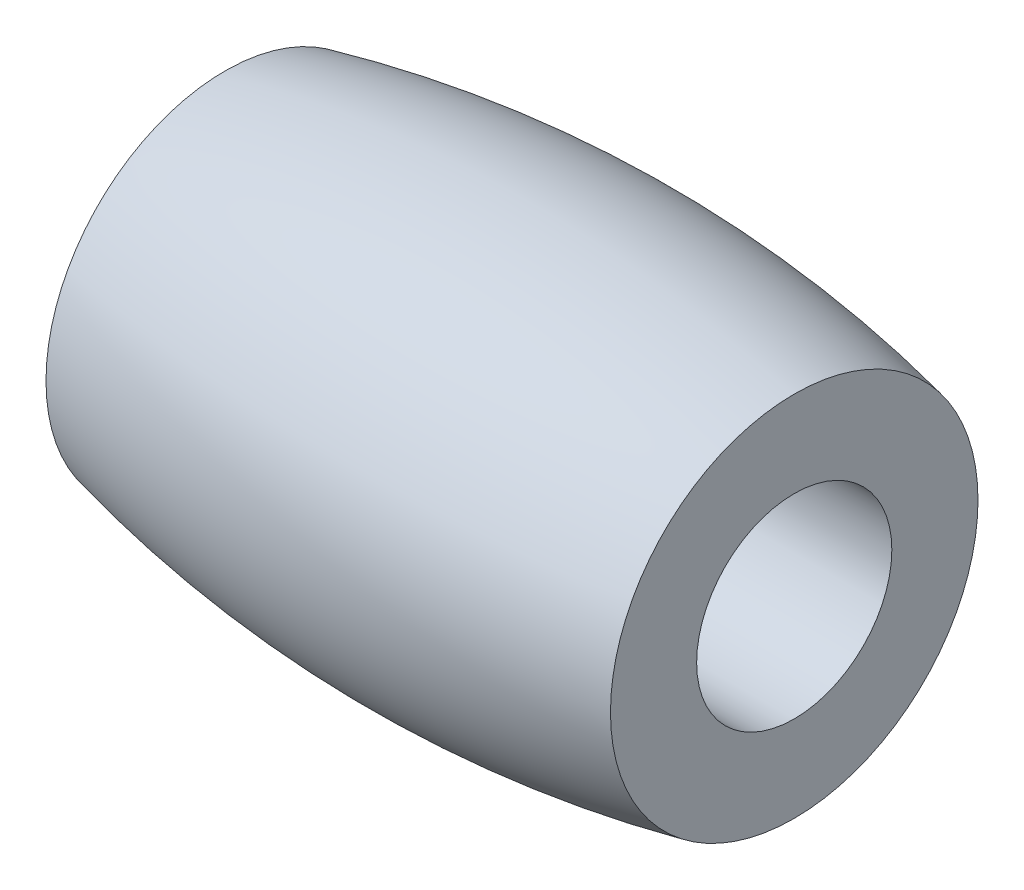
ISO-10303-21;
HEADER;
FILE_DESCRIPTION(('STEP AP214'),'2;1');
FILE_NAME('part.step','',(''),(''),'','','');
FILE_SCHEMA(('AUTOMOTIVE_DESIGN { 1 0 10303 214 1 1 1 1 }'));
ENDSEC;
DATA;
#1=APPLICATION_CONTEXT('core data for automotive mechanical design processes');
#2=APPLICATION_PROTOCOL_DEFINITION('international standard','automotive_design',2000,#1);
#3=PRODUCT_CONTEXT('',#1,'mechanical');
#4=PRODUCT('Part','Part','',(#3));
#5=PRODUCT_RELATED_PRODUCT_CATEGORY('part','',(#4));
#6=PRODUCT_DEFINITION_FORMATION('','',#4);
#7=PRODUCT_DEFINITION_CONTEXT('part definition',#1,'design');
#8=PRODUCT_DEFINITION('design','',#6,#7);
#9=PRODUCT_DEFINITION_SHAPE('','',#8);
#10=(LENGTH_UNIT() NAMED_UNIT(*) SI_UNIT(.MILLI.,.METRE.));
#11=(NAMED_UNIT(*) PLANE_ANGLE_UNIT() SI_UNIT($,.RADIAN.));
#12=(NAMED_UNIT(*) SI_UNIT($,.STERADIAN.) SOLID_ANGLE_UNIT());
#13=UNCERTAINTY_MEASURE_WITH_UNIT(LENGTH_MEASURE(1.E-05),#10,'distance_accuracy_value','');
#14=(GEOMETRIC_REPRESENTATION_CONTEXT(3) GLOBAL_UNCERTAINTY_ASSIGNED_CONTEXT((#13)) GLOBAL_UNIT_ASSIGNED_CONTEXT((#10,
#11,#12)) REPRESENTATION_CONTEXT('',''));
#15=CARTESIAN_POINT('',(0.,0.,0.));
#16=DIRECTION('',(0.,0.,1.));
#17=DIRECTION('',(1.,0.,0.));
#18=AXIS2_PLACEMENT_3D('',#15,#16,#17);
#19=CARTESIAN_POINT('',(-13.2061594202898,0.,0.));
#20=DIRECTION('',(1.,0.,0.));
#21=DIRECTION('',(0.,0.,-1.));
#22=AXIS2_PLACEMENT_3D('',#19,#20,#21);
#23=PLANE('',#22);
#24=CARTESIAN_POINT('',(-13.2061594202898,-3.81,0.));
#25=DIRECTION('',(-1.,0.,0.));
#26=DIRECTION('',(0.,0.,1.));
#27=AXIS2_PLACEMENT_3D('',#24,#25,#26);
#28=CIRCLE('',#27,3.81);
#29=CARTESIAN_POINT('',(-13.2061594202898,-3.81,3.81));
#30=VERTEX_POINT('',#29);
#31=EDGE_CURVE('E54',#30,#30,#28,.T.);
#32=ORIENTED_EDGE('',*,*,#31,.F.);
#33=EDGE_LOOP('',(#32));
#34=FACE_BOUND('',#33,.T.);
#35=CARTESIAN_POINT('',(-13.2061594202898,-3.81,0.));
#36=DIRECTION('',(-1.,0.,0.));
#37=DIRECTION('',(0.,0.,1.));
#38=AXIS2_PLACEMENT_3D('',#35,#36,#37);
#39=CIRCLE('',#38,6.985);
#40=CARTESIAN_POINT('',(-13.2061594202898,-3.81,6.985));
#41=VERTEX_POINT('',#40);
#42=EDGE_CURVE('E10',#41,#41,#39,.T.);
#43=ORIENTED_EDGE('',*,*,#42,.T.);
#44=EDGE_LOOP('',(#43));
#45=FACE_BOUND('',#44,.T.);
#46=ADVANCED_FACE('F37',(#34,#45),#23,.F.);
#47=CARTESIAN_POINT('',(-1.67259138276957,-3.81,0.));
#48=DIRECTION('',(-1.,0.,0.));
#49=DIRECTION('',(0.,0.,1.));
#50=AXIS2_PLACEMENT_3D('',#47,#48,#49);
#51=DEGENERATE_TOROIDAL_SURFACE('',#50,42.4883949544994,50.8,.F.);
#52=ORIENTED_EDGE('',*,*,#42,.F.);
#53=EDGE_LOOP('',(#52));
#54=FACE_BOUND('',#53,.T.);
#55=CARTESIAN_POINT('',(9.01884057971015,-3.81,0.));
#56=DIRECTION('',(-1.,0.,0.));
#57=DIRECTION('',(0.,0.,1.));
#58=AXIS2_PLACEMENT_3D('',#55,#56,#57);
#59=CIRCLE('',#58,7.1737967268155);
#60=CARTESIAN_POINT('',(9.01884057971015,-3.81,7.1737967268155));
#61=VERTEX_POINT('',#60);
#62=EDGE_CURVE('E44',#61,#61,#59,.T.);
#63=ORIENTED_EDGE('',*,*,#62,.T.);
#64=EDGE_LOOP('',(#63));
#65=FACE_BOUND('',#64,.T.);
#66=ADVANCED_FACE('F64',(#54,#65),#51,.F.);
#67=CARTESIAN_POINT('',(9.01884057971015,0.,0.));
#68=DIRECTION('',(-1.,0.,0.));
#69=DIRECTION('',(0.,0.,1.));
#70=AXIS2_PLACEMENT_3D('',#67,#68,#69);
#71=PLANE('',#70);
#72=ORIENTED_EDGE('',*,*,#62,.F.);
#73=EDGE_LOOP('',(#72));
#74=FACE_BOUND('',#73,.T.);
#75=CARTESIAN_POINT('',(9.01884057971015,-3.81,0.));
#76=DIRECTION('',(-1.,0.,0.));
#77=DIRECTION('',(0.,0.,1.));
#78=AXIS2_PLACEMENT_3D('',#75,#76,#77);
#79=CIRCLE('',#78,3.81);
#80=CARTESIAN_POINT('',(9.01884057971015,-3.81,3.81));
#81=VERTEX_POINT('',#80);
#82=EDGE_CURVE('E49',#81,#81,#79,.T.);
#83=ORIENTED_EDGE('',*,*,#82,.T.);
#84=EDGE_LOOP('',(#83));
#85=FACE_BOUND('',#84,.T.);
#86=ADVANCED_FACE('F68',(#74,#85),#71,.F.);
#87=CARTESIAN_POINT('',(-13.2061594202898,-3.81,0.));
#88=DIRECTION('',(-1.,0.,0.));
#89=DIRECTION('',(0.,0.,1.));
#90=AXIS2_PLACEMENT_3D('',#87,#88,#89);
#91=CYLINDRICAL_SURFACE('',#90,3.81);
#92=ORIENTED_EDGE('',*,*,#82,.F.);
#93=EDGE_LOOP('',(#92));
#94=FACE_BOUND('',#93,.T.);
#95=ORIENTED_EDGE('',*,*,#31,.T.);
#96=EDGE_LOOP('',(#95));
#97=FACE_BOUND('',#96,.T.);
#98=ADVANCED_FACE('F61',(#94,#97),#91,.F.);
#99=CLOSED_SHELL('',(#46,#66,#86,#98));
#100=MANIFOLD_SOLID_BREP('B2',#99);
#101=ADVANCED_BREP_SHAPE_REPRESENTATION('',(#18,#100),#14);
#102=SHAPE_DEFINITION_REPRESENTATION(#9,#101);
ENDSEC;
END-ISO-10303-21;
